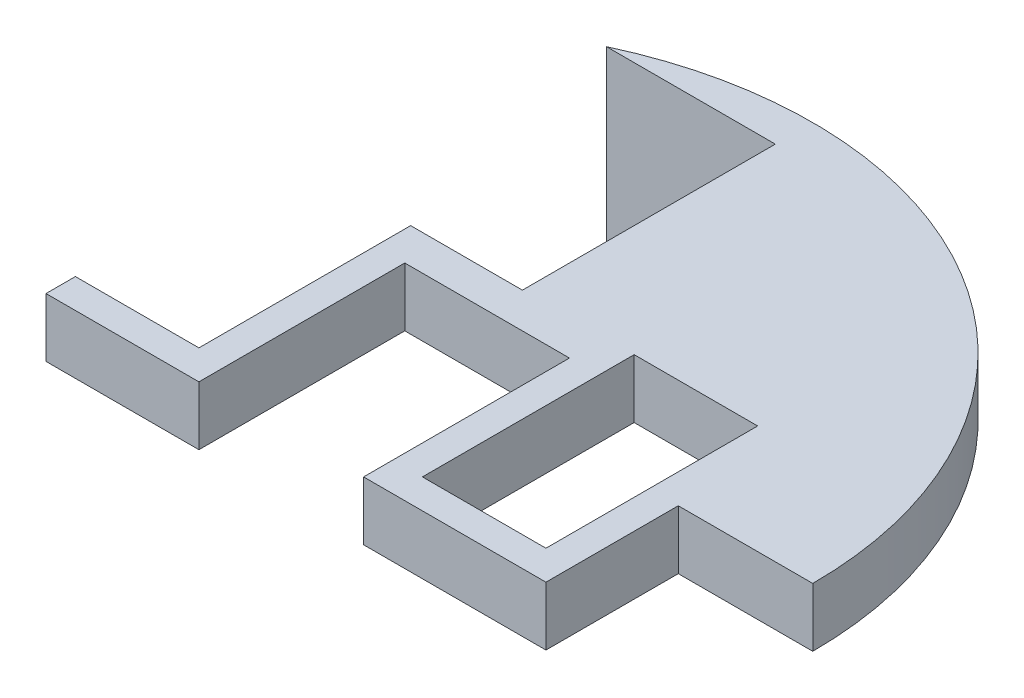
ISO-10303-21;
HEADER;
FILE_DESCRIPTION(('STEP AP214'),'2;1');
FILE_NAME('part.step','',(''),(''),'','','');
FILE_SCHEMA(('AUTOMOTIVE_DESIGN { 1 0 10303 214 1 1 1 1 }'));
ENDSEC;
DATA;
#1=APPLICATION_CONTEXT('core data for automotive mechanical design processes');
#2=APPLICATION_PROTOCOL_DEFINITION('international standard','automotive_design',2000,#1);
#3=PRODUCT_CONTEXT('',#1,'mechanical');
#4=PRODUCT('Part','Part','',(#3));
#5=PRODUCT_RELATED_PRODUCT_CATEGORY('part','',(#4));
#6=PRODUCT_DEFINITION_FORMATION('','',#4);
#7=PRODUCT_DEFINITION_CONTEXT('part definition',#1,'design');
#8=PRODUCT_DEFINITION('design','',#6,#7);
#9=PRODUCT_DEFINITION_SHAPE('','',#8);
#10=(LENGTH_UNIT() NAMED_UNIT(*) SI_UNIT(.MILLI.,.METRE.));
#11=(NAMED_UNIT(*) PLANE_ANGLE_UNIT() SI_UNIT($,.RADIAN.));
#12=(NAMED_UNIT(*) SI_UNIT($,.STERADIAN.) SOLID_ANGLE_UNIT());
#13=UNCERTAINTY_MEASURE_WITH_UNIT(LENGTH_MEASURE(1.E-05),#10,'distance_accuracy_value','');
#14=(GEOMETRIC_REPRESENTATION_CONTEXT(3) GLOBAL_UNCERTAINTY_ASSIGNED_CONTEXT((#13)) GLOBAL_UNIT_ASSIGNED_CONTEXT((#10,
#11,#12)) REPRESENTATION_CONTEXT('',''));
#15=CARTESIAN_POINT('',(0.,0.,0.));
#16=DIRECTION('',(0.,0.,1.));
#17=DIRECTION('',(1.,0.,0.));
#18=AXIS2_PLACEMENT_3D('',#15,#16,#17);
#19=CARTESIAN_POINT('',(0.,0.,0.));
#20=DIRECTION('',(0.,1.,0.));
#21=DIRECTION('',(0.,0.,1.));
#22=AXIS2_PLACEMENT_3D('',#19,#20,#21);
#23=PLANE('',#22);
#24=DIRECTION('',(0.,0.,1.));
#25=VECTOR('',#24,1.);
#26=CARTESIAN_POINT('',(19.,0.,-18.5));
#27=LINE('',#26,#25);
#28=CARTESIAN_POINT('',(19.,0.,-18.5));
#29=VERTEX_POINT('',#28);
#30=CARTESIAN_POINT('',(19.,0.,17.5));
#31=VERTEX_POINT('',#30);
#32=EDGE_CURVE('E253',#29,#31,#27,.T.);
#33=ORIENTED_EDGE('',*,*,#32,.T.);
#34=DIRECTION('',(1.,0.,0.));
#35=VECTOR('',#34,1.);
#36=CARTESIAN_POINT('',(40.,0.,17.5));
#37=LINE('',#36,#35);
#38=CARTESIAN_POINT('',(40.,0.,17.5));
#39=VERTEX_POINT('',#38);
#40=EDGE_CURVE('E259',#31,#39,#37,.T.);
#41=ORIENTED_EDGE('',*,*,#40,.T.);
#42=DIRECTION('',(0.,0.,-1.));
#43=VECTOR('',#42,1.);
#44=CARTESIAN_POINT('',(40.,0.,-18.5));
#45=LINE('',#44,#43);
#46=CARTESIAN_POINT('',(40.,0.,-18.5));
#47=VERTEX_POINT('',#46);
#48=EDGE_CURVE('E283',#39,#47,#45,.T.);
#49=ORIENTED_EDGE('',*,*,#48,.T.);
#50=DIRECTION('',(-1.,0.,0.));
#51=VECTOR('',#50,1.);
#52=CARTESIAN_POINT('',(40.,0.,-18.5));
#53=LINE('',#52,#51);
#54=EDGE_CURVE('E269',#47,#29,#53,.T.);
#55=ORIENTED_EDGE('',*,*,#54,.T.);
#56=EDGE_LOOP('',(#33,#41,#49,#55));
#57=FACE_BOUND('',#56,.T.);
#58=DIRECTION('',(-1.12508110670557E-13,0.,1.));
#59=VECTOR('',#58,1.);
#60=CARTESIAN_POINT('',(0.,0.,-61.5));
#61=LINE('',#60,#59);
#62=CARTESIAN_POINT('',(1.2793585635329E-12,0.,-67.865));
#63=VERTEX_POINT('',#62);
#64=CARTESIAN_POINT('',(0.,0.,-61.5));
#65=VERTEX_POINT('',#64);
#66=EDGE_CURVE('E65',#63,#65,#61,.T.);
#67=ORIENTED_EDGE('',*,*,#66,.F.);
#68=CARTESIAN_POINT('',(0.,0.,0.));
#69=DIRECTION('',(0.,1.,0.));
#70=DIRECTION('',(0.,0.,1.));
#71=AXIS2_PLACEMENT_3D('',#68,#69,#70);
#72=CIRCLE('',#71,67.865);
#73=CARTESIAN_POINT('',(67.865,0.,-2.6188257756783E-13));
#74=VERTEX_POINT('',#73);
#75=EDGE_CURVE('E347',#74,#63,#72,.T.);
#76=ORIENTED_EDGE('',*,*,#75,.F.);
#77=DIRECTION('',(1.,0.,0.));
#78=VECTOR('',#77,1.);
#79=CARTESIAN_POINT('',(67.865,0.,-2.6188257756783E-13));
#80=LINE('',#79,#78);
#81=CARTESIAN_POINT('',(45.,0.,-1.7364939203643E-13));
#82=VERTEX_POINT('',#81);
#83=EDGE_CURVE('E308',#82,#74,#80,.T.);
#84=ORIENTED_EDGE('',*,*,#83,.F.);
#85=DIRECTION('',(0.,0.,-1.));
#86=VECTOR('',#85,1.);
#87=CARTESIAN_POINT('',(45.,0.,-1.7364939203643E-13));
#88=LINE('',#87,#86);
#89=CARTESIAN_POINT('',(45.,0.,22.5));
#90=VERTEX_POINT('',#89);
#91=EDGE_CURVE('E382',#90,#82,#88,.T.);
#92=ORIENTED_EDGE('',*,*,#91,.F.);
#93=DIRECTION('',(1.,0.,0.));
#94=VECTOR('',#93,1.);
#95=CARTESIAN_POINT('',(45.,0.,22.5));
#96=LINE('',#95,#94);
#97=CARTESIAN_POINT('',(14.,0.,22.5));
#98=VERTEX_POINT('',#97);
#99=EDGE_CURVE('E379',#98,#90,#96,.T.);
#100=ORIENTED_EDGE('',*,*,#99,.F.);
#101=DIRECTION('',(0.,0.,1.));
#102=VECTOR('',#101,1.);
#103=CARTESIAN_POINT('',(14.,0.,22.5));
#104=LINE('',#103,#102);
#105=CARTESIAN_POINT('',(14.,0.,-12.4999999999999));
#106=VERTEX_POINT('',#105);
#107=EDGE_CURVE('E376',#106,#98,#104,.T.);
#108=ORIENTED_EDGE('',*,*,#107,.F.);
#109=DIRECTION('',(1.,0.,0.));
#110=VECTOR('',#109,1.);
#111=CARTESIAN_POINT('',(-14.,0.,-12.5));
#112=LINE('',#111,#110);
#113=CARTESIAN_POINT('',(-14.,0.,-12.5));
#114=VERTEX_POINT('',#113);
#115=EDGE_CURVE('E373',#114,#106,#112,.T.);
#116=ORIENTED_EDGE('',*,*,#115,.F.);
#117=DIRECTION('',(0.,0.,-1.));
#118=VECTOR('',#117,1.);
#119=CARTESIAN_POINT('',(-14.,0.,-12.5));
#120=LINE('',#119,#118);
#121=CARTESIAN_POINT('',(-14.,0.,22.5));
#122=VERTEX_POINT('',#121);
#123=EDGE_CURVE('E370',#122,#114,#120,.T.);
#124=ORIENTED_EDGE('',*,*,#123,.F.);
#125=DIRECTION('',(1.,0.,0.));
#126=VECTOR('',#125,1.);
#127=CARTESIAN_POINT('',(-14.,0.,22.5));
#128=LINE('',#127,#126);
#129=CARTESIAN_POINT('',(-40.,0.,22.5));
#130=VERTEX_POINT('',#129);
#131=EDGE_CURVE('E367',#130,#122,#128,.T.);
#132=ORIENTED_EDGE('',*,*,#131,.F.);
#133=DIRECTION('',(0.,0.,1.));
#134=VECTOR('',#133,1.);
#135=CARTESIAN_POINT('',(-40.,0.,22.5));
#136=LINE('',#135,#134);
#137=CARTESIAN_POINT('',(-40.,0.,17.5));
#138=VERTEX_POINT('',#137);
#139=EDGE_CURVE('E364',#138,#130,#136,.T.);
#140=ORIENTED_EDGE('',*,*,#139,.F.);
#141=DIRECTION('',(-1.,0.,0.));
#142=VECTOR('',#141,1.);
#143=CARTESIAN_POINT('',(-40.,0.,17.5));
#144=LINE('',#143,#142);
#145=CARTESIAN_POINT('',(-19.,0.,17.5));
#146=VERTEX_POINT('',#145);
#147=EDGE_CURVE('E361',#146,#138,#144,.T.);
#148=ORIENTED_EDGE('',*,*,#147,.F.);
#149=DIRECTION('',(0.,0.,1.));
#150=VECTOR('',#149,1.);
#151=CARTESIAN_POINT('',(-19.,0.,-18.5));
#152=LINE('',#151,#150);
#153=CARTESIAN_POINT('',(-19.,0.,-18.5));
#154=VERTEX_POINT('',#153);
#155=EDGE_CURVE('E358',#154,#146,#152,.T.);
#156=ORIENTED_EDGE('',*,*,#155,.F.);
#157=DIRECTION('',(-1.,0.,0.));
#158=VECTOR('',#157,1.);
#159=CARTESIAN_POINT('',(-19.,0.,-18.5));
#160=LINE('',#159,#158);
#161=CARTESIAN_POINT('',(0.,0.,-18.5));
#162=VERTEX_POINT('',#161);
#163=EDGE_CURVE('E355',#162,#154,#160,.T.);
#164=ORIENTED_EDGE('',*,*,#163,.F.);
#165=DIRECTION('',(0.,0.,1.));
#166=VECTOR('',#165,1.);
#167=CARTESIAN_POINT('',(0.,0.,-61.5));
#168=LINE('',#167,#166);
#169=EDGE_CURVE('E351',#65,#162,#168,.T.);
#170=ORIENTED_EDGE('',*,*,#169,.F.);
#171=EDGE_LOOP('',(#67,#76,#84,#92,#100,#108,#116,#124,#132,#140,#148,#156,#164,#170));
#172=FACE_BOUND('',#171,.T.);
#173=ADVANCED_FACE('F38',(#57,#172),#23,.F.);
#174=DIRECTION('',(0.999863281102752,0.,-0.0165353893948497));
#175=VECTOR('',#174,1.);
#176=CARTESIAN_POINT('',(-2.24404155772547,0.,-67.8278888252259));
#177=LINE('',#176,#175);
#178=CARTESIAN_POINT('',(-2.24404155772553,0.,-67.8278888252259));
#179=VERTEX_POINT('',#178);
#180=EDGE_CURVE('E56',#179,#63,#177,.T.);
#181=ORIENTED_EDGE('',*,*,#180,.F.);
#182=EDGE_CURVE('E352',#63,#179,#72,.T.);
#183=ORIENTED_EDGE('',*,*,#182,.F.);
#184=EDGE_LOOP('',(#181,#183));
#185=FACE_BOUND('',#184,.T.);
#186=ADVANCED_FACE('F486',(#185),#23,.F.);
#187=DIRECTION('',(0.989100340970342,0.,-0.147243049045966));
#188=VECTOR('',#187,1.);
#189=CARTESIAN_POINT('',(-17.6099188939027,0.,-65.5404377583043));
#190=LINE('',#189,#188);
#191=CARTESIAN_POINT('',(-17.6099188939027,0.,-65.5404377583043));
#192=VERTEX_POINT('',#191);
#193=EDGE_CURVE('E469',#192,#179,#190,.T.);
#194=ORIENTED_EDGE('',*,*,#193,.F.);
#195=EDGE_CURVE('E481',#179,#192,#72,.T.);
#196=ORIENTED_EDGE('',*,*,#195,.F.);
#197=EDGE_LOOP('',(#194,#196));
#198=FACE_BOUND('',#197,.T.);
#199=ADVANCED_FACE('F488',(#198),#23,.F.);
#200=DIRECTION('',(0.93953547691471,0.,-0.342451584342441));
#201=VECTOR('',#200,1.);
#202=CARTESIAN_POINT('',(-28.6950906079769,0.,-61.5));
#203=LINE('',#202,#201);
#204=CARTESIAN_POINT('',(-28.6950906079769,0.,-61.5));
#205=VERTEX_POINT('',#204);
#206=EDGE_CURVE('E471',#205,#192,#203,.T.);
#207=ORIENTED_EDGE('',*,*,#206,.F.);
#208=EDGE_CURVE('E302',#192,#205,#72,.T.);
#209=ORIENTED_EDGE('',*,*,#208,.F.);
#210=EDGE_LOOP('',(#207,#209));
#211=FACE_BOUND('',#210,.T.);
#212=ADVANCED_FACE('F494',(#211),#23,.F.);
#213=CARTESIAN_POINT('',(0.,10.,0.));
#214=DIRECTION('',(0.,1.,0.));
#215=DIRECTION('',(0.,0.,1.));
#216=AXIS2_PLACEMENT_3D('',#213,#214,#215);
#217=PLANE('',#216);
#218=CARTESIAN_POINT('',(0.,10.,0.));
#219=DIRECTION('',(0.,1.,0.));
#220=DIRECTION('',(0.,0.,1.));
#221=AXIS2_PLACEMENT_3D('',#218,#219,#220);
#222=CIRCLE('',#221,67.865);
#223=CARTESIAN_POINT('',(67.865,10.,-2.6188257756783E-13));
#224=VERTEX_POINT('',#223);
#225=CARTESIAN_POINT('',(-28.6950906079769,10.,-61.5));
#226=VERTEX_POINT('',#225);
#227=EDGE_CURVE('E303',#224,#226,#222,.T.);
#228=ORIENTED_EDGE('',*,*,#227,.T.);
#229=DIRECTION('',(1.,0.,0.));
#230=VECTOR('',#229,1.);
#231=CARTESIAN_POINT('',(-28.6950906079769,10.,-61.5));
#232=LINE('',#231,#230);
#233=CARTESIAN_POINT('',(0.,10.,-61.5));
#234=VERTEX_POINT('',#233);
#235=EDGE_CURVE('E307',#226,#234,#232,.T.);
#236=ORIENTED_EDGE('',*,*,#235,.T.);
#237=DIRECTION('',(0.,0.,1.));
#238=VECTOR('',#237,1.);
#239=CARTESIAN_POINT('',(0.,10.,-61.5));
#240=LINE('',#239,#238);
#241=CARTESIAN_POINT('',(0.,10.,-18.5));
#242=VERTEX_POINT('',#241);
#243=EDGE_CURVE('E311',#234,#242,#240,.T.);
#244=ORIENTED_EDGE('',*,*,#243,.T.);
#245=DIRECTION('',(-1.,0.,0.));
#246=VECTOR('',#245,1.);
#247=CARTESIAN_POINT('',(-19.,10.,-18.5));
#248=LINE('',#247,#246);
#249=CARTESIAN_POINT('',(-19.,10.,-18.5));
#250=VERTEX_POINT('',#249);
#251=EDGE_CURVE('E314',#242,#250,#248,.T.);
#252=ORIENTED_EDGE('',*,*,#251,.T.);
#253=DIRECTION('',(0.,0.,1.));
#254=VECTOR('',#253,1.);
#255=CARTESIAN_POINT('',(-19.,10.,-18.5));
#256=LINE('',#255,#254);
#257=CARTESIAN_POINT('',(-19.,10.,17.5));
#258=VERTEX_POINT('',#257);
#259=EDGE_CURVE('E317',#250,#258,#256,.T.);
#260=ORIENTED_EDGE('',*,*,#259,.T.);
#261=DIRECTION('',(-1.,0.,0.));
#262=VECTOR('',#261,1.);
#263=CARTESIAN_POINT('',(-40.,10.,17.5));
#264=LINE('',#263,#262);
#265=CARTESIAN_POINT('',(-40.,10.,17.5));
#266=VERTEX_POINT('',#265);
#267=EDGE_CURVE('E320',#258,#266,#264,.T.);
#268=ORIENTED_EDGE('',*,*,#267,.T.);
#269=DIRECTION('',(0.,0.,1.));
#270=VECTOR('',#269,1.);
#271=CARTESIAN_POINT('',(-40.,10.,22.5));
#272=LINE('',#271,#270);
#273=CARTESIAN_POINT('',(-40.,10.,22.5));
#274=VERTEX_POINT('',#273);
#275=EDGE_CURVE('E323',#266,#274,#272,.T.);
#276=ORIENTED_EDGE('',*,*,#275,.T.);
#277=DIRECTION('',(1.,0.,0.));
#278=VECTOR('',#277,1.);
#279=CARTESIAN_POINT('',(-14.,10.,22.5));
#280=LINE('',#279,#278);
#281=CARTESIAN_POINT('',(-14.,10.,22.5));
#282=VERTEX_POINT('',#281);
#283=EDGE_CURVE('E326',#274,#282,#280,.T.);
#284=ORIENTED_EDGE('',*,*,#283,.T.);
#285=DIRECTION('',(0.,0.,-1.));
#286=VECTOR('',#285,1.);
#287=CARTESIAN_POINT('',(-14.,10.,-12.5));
#288=LINE('',#287,#286);
#289=CARTESIAN_POINT('',(-14.,10.,-12.5));
#290=VERTEX_POINT('',#289);
#291=EDGE_CURVE('E329',#282,#290,#288,.T.);
#292=ORIENTED_EDGE('',*,*,#291,.T.);
#293=DIRECTION('',(1.,0.,0.));
#294=VECTOR('',#293,1.);
#295=CARTESIAN_POINT('',(-14.,10.,-12.5));
#296=LINE('',#295,#294);
#297=CARTESIAN_POINT('',(14.,10.,-12.4999999999999));
#298=VERTEX_POINT('',#297);
#299=EDGE_CURVE('E332',#290,#298,#296,.T.);
#300=ORIENTED_EDGE('',*,*,#299,.T.);
#301=DIRECTION('',(0.,0.,1.));
#302=VECTOR('',#301,1.);
#303=CARTESIAN_POINT('',(14.,10.,22.5));
#304=LINE('',#303,#302);
#305=CARTESIAN_POINT('',(14.,10.,22.5));
#306=VERTEX_POINT('',#305);
#307=EDGE_CURVE('E335',#298,#306,#304,.T.);
#308=ORIENTED_EDGE('',*,*,#307,.T.);
#309=DIRECTION('',(1.,0.,0.));
#310=VECTOR('',#309,1.);
#311=CARTESIAN_POINT('',(45.,10.,22.5));
#312=LINE('',#311,#310);
#313=CARTESIAN_POINT('',(45.,10.,22.5));
#314=VERTEX_POINT('',#313);
#315=EDGE_CURVE('E338',#306,#314,#312,.T.);
#316=ORIENTED_EDGE('',*,*,#315,.T.);
#317=DIRECTION('',(0.,0.,-1.));
#318=VECTOR('',#317,1.);
#319=CARTESIAN_POINT('',(45.,10.,-1.7364939203643E-13));
#320=LINE('',#319,#318);
#321=CARTESIAN_POINT('',(45.,10.,-1.7364939203643E-13));
#322=VERTEX_POINT('',#321);
#323=EDGE_CURVE('E341',#314,#322,#320,.T.);
#324=ORIENTED_EDGE('',*,*,#323,.T.);
#325=DIRECTION('',(1.,0.,0.));
#326=VECTOR('',#325,1.);
#327=CARTESIAN_POINT('',(67.865,10.,-2.6188257756783E-13));
#328=LINE('',#327,#326);
#329=EDGE_CURVE('E344',#322,#224,#328,.T.);
#330=ORIENTED_EDGE('',*,*,#329,.T.);
#331=EDGE_LOOP('',(#228,#236,#244,#252,#260,#268,#276,#284,#292,#300,#308,#316,#324,#330));
#332=FACE_BOUND('',#331,.T.);
#333=DIRECTION('',(1.,0.,0.));
#334=VECTOR('',#333,1.);
#335=CARTESIAN_POINT('',(40.,10.,17.5));
#336=LINE('',#335,#334);
#337=CARTESIAN_POINT('',(19.,10.,17.5));
#338=VERTEX_POINT('',#337);
#339=CARTESIAN_POINT('',(40.,10.,17.5));
#340=VERTEX_POINT('',#339);
#341=EDGE_CURVE('E268',#338,#340,#336,.T.);
#342=ORIENTED_EDGE('',*,*,#341,.F.);
#343=DIRECTION('',(0.,0.,1.));
#344=VECTOR('',#343,1.);
#345=CARTESIAN_POINT('',(19.,10.,-18.5));
#346=LINE('',#345,#344);
#347=CARTESIAN_POINT('',(19.,10.,-18.5));
#348=VERTEX_POINT('',#347);
#349=EDGE_CURVE('E265',#348,#338,#346,.T.);
#350=ORIENTED_EDGE('',*,*,#349,.F.);
#351=DIRECTION('',(-1.,0.,0.));
#352=VECTOR('',#351,1.);
#353=CARTESIAN_POINT('',(40.,10.,-18.5));
#354=LINE('',#353,#352);
#355=CARTESIAN_POINT('',(40.,10.,-18.5));
#356=VERTEX_POINT('',#355);
#357=EDGE_CURVE('E276',#356,#348,#354,.T.);
#358=ORIENTED_EDGE('',*,*,#357,.F.);
#359=DIRECTION('',(0.,0.,-1.));
#360=VECTOR('',#359,1.);
#361=CARTESIAN_POINT('',(40.,10.,-18.5));
#362=LINE('',#361,#360);
#363=EDGE_CURVE('E272',#340,#356,#362,.T.);
#364=ORIENTED_EDGE('',*,*,#363,.F.);
#365=EDGE_LOOP('',(#342,#350,#358,#364));
#366=FACE_BOUND('',#365,.T.);
#367=ADVANCED_FACE('F498',(#332,#366),#217,.T.);
#368=CARTESIAN_POINT('',(0.,10.,0.));
#369=DIRECTION('',(0.,-1.,0.));
#370=DIRECTION('',(0.,0.,-1.));
#371=AXIS2_PLACEMENT_3D('',#368,#369,#370);
#372=CYLINDRICAL_SURFACE('',#371,67.865);
#373=ORIENTED_EDGE('',*,*,#75,.T.);
#374=ORIENTED_EDGE('',*,*,#182,.T.);
#375=ORIENTED_EDGE('',*,*,#195,.T.);
#376=ORIENTED_EDGE('',*,*,#208,.T.);
#377=DIRECTION('',(0.,-1.,0.));
#378=VECTOR('',#377,1.);
#379=CARTESIAN_POINT('',(-28.6950906079769,10.,-61.5));
#380=LINE('',#379,#378);
#381=EDGE_CURVE('E11',#226,#205,#380,.T.);
#382=ORIENTED_EDGE('',*,*,#381,.F.);
#383=ORIENTED_EDGE('',*,*,#227,.F.);
#384=DIRECTION('',(0.,-1.,0.));
#385=VECTOR('',#384,1.);
#386=CARTESIAN_POINT('',(67.865,10.,-2.6188257756783E-13));
#387=LINE('',#386,#385);
#388=EDGE_CURVE('E346',#224,#74,#387,.T.);
#389=ORIENTED_EDGE('',*,*,#388,.T.);
#390=EDGE_LOOP('',(#373,#374,#375,#376,#382,#383,#389));
#391=FACE_BOUND('',#390,.T.);
#392=ADVANCED_FACE('F40',(#391),#372,.T.);
#393=CARTESIAN_POINT('',(-28.6950906079769,10.,-61.5));
#394=DIRECTION('',(0.,0.,-1.));
#395=DIRECTION('',(-1.,0.,0.));
#396=AXIS2_PLACEMENT_3D('',#393,#394,#395);
#397=PLANE('',#396);
#398=ORIENTED_EDGE('',*,*,#381,.T.);
#399=DIRECTION('',(0.,1.,0.));
#400=VECTOR('',#399,1.);
#401=CARTESIAN_POINT('',(-28.6950906079769,-30.,-61.5));
#402=LINE('',#401,#400);
#403=CARTESIAN_POINT('',(-28.6950906079769,-30.,-61.5));
#404=VERTEX_POINT('',#403);
#405=EDGE_CURVE('E232',#404,#205,#402,.T.);
#406=ORIENTED_EDGE('',*,*,#405,.F.);
#407=DIRECTION('',(-1.,0.,0.));
#408=VECTOR('',#407,1.);
#409=CARTESIAN_POINT('',(0.,-30.,-61.5));
#410=LINE('',#409,#408);
#411=CARTESIAN_POINT('',(0.,-30.,-61.5));
#412=VERTEX_POINT('',#411);
#413=EDGE_CURVE('E239',#412,#404,#410,.T.);
#414=ORIENTED_EDGE('',*,*,#413,.F.);
#415=DIRECTION('',(0.,1.,0.));
#416=VECTOR('',#415,1.);
#417=CARTESIAN_POINT('',(0.,-30.,-61.5));
#418=LINE('',#417,#416);
#419=EDGE_CURVE('E445',#412,#65,#418,.T.);
#420=ORIENTED_EDGE('',*,*,#419,.T.);
#421=DIRECTION('',(0.,-1.,0.));
#422=VECTOR('',#421,1.);
#423=CARTESIAN_POINT('',(0.,10.,-61.5));
#424=LINE('',#423,#422);
#425=EDGE_CURVE('E47',#234,#65,#424,.T.);
#426=ORIENTED_EDGE('',*,*,#425,.F.);
#427=ORIENTED_EDGE('',*,*,#235,.F.);
#428=EDGE_LOOP('',(#398,#406,#414,#420,#426,#427));
#429=FACE_BOUND('',#428,.T.);
#430=ADVANCED_FACE('F250',(#429),#397,.F.);
#431=CARTESIAN_POINT('',(0.,10.,-61.5));
#432=DIRECTION('',(1.,0.,0.));
#433=DIRECTION('',(0.,0.,-1.));
#434=AXIS2_PLACEMENT_3D('',#431,#432,#433);
#435=PLANE('',#434);
#436=ORIENTED_EDGE('',*,*,#169,.T.);
#437=DIRECTION('',(0.,-1.,0.));
#438=VECTOR('',#437,1.);
#439=CARTESIAN_POINT('',(0.,10.,-18.5));
#440=LINE('',#439,#438);
#441=EDGE_CURVE('E430',#242,#162,#440,.T.);
#442=ORIENTED_EDGE('',*,*,#441,.F.);
#443=ORIENTED_EDGE('',*,*,#243,.F.);
#444=ORIENTED_EDGE('',*,*,#425,.T.);
#445=EDGE_LOOP('',(#436,#442,#443,#444));
#446=FACE_BOUND('',#445,.T.);
#447=ADVANCED_FACE('F438',(#446),#435,.F.);
#448=CARTESIAN_POINT('',(-19.,10.,-18.5));
#449=DIRECTION('',(0.,0.,1.));
#450=DIRECTION('',(1.,0.,0.));
#451=AXIS2_PLACEMENT_3D('',#448,#449,#450);
#452=PLANE('',#451);
#453=ORIENTED_EDGE('',*,*,#163,.T.);
#454=DIRECTION('',(0.,-1.,0.));
#455=VECTOR('',#454,1.);
#456=CARTESIAN_POINT('',(-19.,10.,-18.5));
#457=LINE('',#456,#455);
#458=EDGE_CURVE('E426',#250,#154,#457,.T.);
#459=ORIENTED_EDGE('',*,*,#458,.F.);
#460=ORIENTED_EDGE('',*,*,#251,.F.);
#461=ORIENTED_EDGE('',*,*,#441,.T.);
#462=EDGE_LOOP('',(#453,#459,#460,#461));
#463=FACE_BOUND('',#462,.T.);
#464=ADVANCED_FACE('F540',(#463),#452,.F.);
#465=CARTESIAN_POINT('',(-19.,10.,-18.5));
#466=DIRECTION('',(1.,0.,0.));
#467=DIRECTION('',(0.,0.,-1.));
#468=AXIS2_PLACEMENT_3D('',#465,#466,#467);
#469=PLANE('',#468);
#470=ORIENTED_EDGE('',*,*,#155,.T.);
#471=DIRECTION('',(0.,-1.,0.));
#472=VECTOR('',#471,1.);
#473=CARTESIAN_POINT('',(-19.,10.,17.5));
#474=LINE('',#473,#472);
#475=EDGE_CURVE('E422',#258,#146,#474,.T.);
#476=ORIENTED_EDGE('',*,*,#475,.F.);
#477=ORIENTED_EDGE('',*,*,#259,.F.);
#478=ORIENTED_EDGE('',*,*,#458,.T.);
#479=EDGE_LOOP('',(#470,#476,#477,#478));
#480=FACE_BOUND('',#479,.T.);
#481=ADVANCED_FACE('F536',(#480),#469,.F.);
#482=CARTESIAN_POINT('',(-40.,10.,17.5));
#483=DIRECTION('',(0.,0.,1.));
#484=DIRECTION('',(1.,0.,0.));
#485=AXIS2_PLACEMENT_3D('',#482,#483,#484);
#486=PLANE('',#485);
#487=ORIENTED_EDGE('',*,*,#147,.T.);
#488=DIRECTION('',(0.,-1.,0.));
#489=VECTOR('',#488,1.);
#490=CARTESIAN_POINT('',(-40.,10.,17.5));
#491=LINE('',#490,#489);
#492=EDGE_CURVE('E418',#266,#138,#491,.T.);
#493=ORIENTED_EDGE('',*,*,#492,.F.);
#494=ORIENTED_EDGE('',*,*,#267,.F.);
#495=ORIENTED_EDGE('',*,*,#475,.T.);
#496=EDGE_LOOP('',(#487,#493,#494,#495));
#497=FACE_BOUND('',#496,.T.);
#498=ADVANCED_FACE('F532',(#497),#486,.F.);
#499=CARTESIAN_POINT('',(-40.,10.,22.5));
#500=DIRECTION('',(1.,0.,0.));
#501=DIRECTION('',(0.,0.,-1.));
#502=AXIS2_PLACEMENT_3D('',#499,#500,#501);
#503=PLANE('',#502);
#504=ORIENTED_EDGE('',*,*,#139,.T.);
#505=DIRECTION('',(0.,-1.,0.));
#506=VECTOR('',#505,1.);
#507=CARTESIAN_POINT('',(-40.,10.,22.5));
#508=LINE('',#507,#506);
#509=EDGE_CURVE('E414',#274,#130,#508,.T.);
#510=ORIENTED_EDGE('',*,*,#509,.F.);
#511=ORIENTED_EDGE('',*,*,#275,.F.);
#512=ORIENTED_EDGE('',*,*,#492,.T.);
#513=EDGE_LOOP('',(#504,#510,#511,#512));
#514=FACE_BOUND('',#513,.T.);
#515=ADVANCED_FACE('F528',(#514),#503,.F.);
#516=CARTESIAN_POINT('',(-14.,10.,22.5));
#517=DIRECTION('',(0.,0.,-1.));
#518=DIRECTION('',(-1.,0.,0.));
#519=AXIS2_PLACEMENT_3D('',#516,#517,#518);
#520=PLANE('',#519);
#521=ORIENTED_EDGE('',*,*,#131,.T.);
#522=DIRECTION('',(0.,-1.,0.));
#523=VECTOR('',#522,1.);
#524=CARTESIAN_POINT('',(-14.,10.,22.5));
#525=LINE('',#524,#523);
#526=EDGE_CURVE('E410',#282,#122,#525,.T.);
#527=ORIENTED_EDGE('',*,*,#526,.F.);
#528=ORIENTED_EDGE('',*,*,#283,.F.);
#529=ORIENTED_EDGE('',*,*,#509,.T.);
#530=EDGE_LOOP('',(#521,#527,#528,#529));
#531=FACE_BOUND('',#530,.T.);
#532=ADVANCED_FACE('F524',(#531),#520,.F.);
#533=CARTESIAN_POINT('',(-14.,10.,-12.5));
#534=DIRECTION('',(-1.,0.,0.));
#535=DIRECTION('',(0.,0.,1.));
#536=AXIS2_PLACEMENT_3D('',#533,#534,#535);
#537=PLANE('',#536);
#538=ORIENTED_EDGE('',*,*,#123,.T.);
#539=DIRECTION('',(0.,-1.,0.));
#540=VECTOR('',#539,1.);
#541=CARTESIAN_POINT('',(-14.,10.,-12.5));
#542=LINE('',#541,#540);
#543=EDGE_CURVE('E406',#290,#114,#542,.T.);
#544=ORIENTED_EDGE('',*,*,#543,.F.);
#545=ORIENTED_EDGE('',*,*,#291,.F.);
#546=ORIENTED_EDGE('',*,*,#526,.T.);
#547=EDGE_LOOP('',(#538,#544,#545,#546));
#548=FACE_BOUND('',#547,.T.);
#549=ADVANCED_FACE('F520',(#548),#537,.F.);
#550=CARTESIAN_POINT('',(-14.,10.,-12.5));
#551=DIRECTION('',(0.,0.,-1.));
#552=DIRECTION('',(-1.,0.,0.));
#553=AXIS2_PLACEMENT_3D('',#550,#551,#552);
#554=PLANE('',#553);
#555=ORIENTED_EDGE('',*,*,#115,.T.);
#556=DIRECTION('',(0.,-1.,0.));
#557=VECTOR('',#556,1.);
#558=CARTESIAN_POINT('',(14.,10.,-12.4999999999999));
#559=LINE('',#558,#557);
#560=EDGE_CURVE('E402',#298,#106,#559,.T.);
#561=ORIENTED_EDGE('',*,*,#560,.F.);
#562=ORIENTED_EDGE('',*,*,#299,.F.);
#563=ORIENTED_EDGE('',*,*,#543,.T.);
#564=EDGE_LOOP('',(#555,#561,#562,#563));
#565=FACE_BOUND('',#564,.T.);
#566=ADVANCED_FACE('F516',(#565),#554,.F.);
#567=CARTESIAN_POINT('',(14.,10.,22.5));
#568=DIRECTION('',(1.,0.,0.));
#569=DIRECTION('',(0.,0.,-1.));
#570=AXIS2_PLACEMENT_3D('',#567,#568,#569);
#571=PLANE('',#570);
#572=ORIENTED_EDGE('',*,*,#107,.T.);
#573=DIRECTION('',(0.,-1.,0.));
#574=VECTOR('',#573,1.);
#575=CARTESIAN_POINT('',(14.,10.,22.5));
#576=LINE('',#575,#574);
#577=EDGE_CURVE('E398',#306,#98,#576,.T.);
#578=ORIENTED_EDGE('',*,*,#577,.F.);
#579=ORIENTED_EDGE('',*,*,#307,.F.);
#580=ORIENTED_EDGE('',*,*,#560,.T.);
#581=EDGE_LOOP('',(#572,#578,#579,#580));
#582=FACE_BOUND('',#581,.T.);
#583=ADVANCED_FACE('F512',(#582),#571,.F.);
#584=CARTESIAN_POINT('',(45.,10.,22.5));
#585=DIRECTION('',(0.,0.,-1.));
#586=DIRECTION('',(-1.,0.,0.));
#587=AXIS2_PLACEMENT_3D('',#584,#585,#586);
#588=PLANE('',#587);
#589=ORIENTED_EDGE('',*,*,#99,.T.);
#590=DIRECTION('',(0.,-1.,0.));
#591=VECTOR('',#590,1.);
#592=CARTESIAN_POINT('',(45.,10.,22.5));
#593=LINE('',#592,#591);
#594=EDGE_CURVE('E394',#314,#90,#593,.T.);
#595=ORIENTED_EDGE('',*,*,#594,.F.);
#596=ORIENTED_EDGE('',*,*,#315,.F.);
#597=ORIENTED_EDGE('',*,*,#577,.T.);
#598=EDGE_LOOP('',(#589,#595,#596,#597));
#599=FACE_BOUND('',#598,.T.);
#600=ADVANCED_FACE('F508',(#599),#588,.F.);
#601=CARTESIAN_POINT('',(45.,10.,-1.7364939203643E-13));
#602=DIRECTION('',(-1.,0.,0.));
#603=DIRECTION('',(0.,0.,1.));
#604=AXIS2_PLACEMENT_3D('',#601,#602,#603);
#605=PLANE('',#604);
#606=ORIENTED_EDGE('',*,*,#91,.T.);
#607=DIRECTION('',(0.,-1.,0.));
#608=VECTOR('',#607,1.);
#609=CARTESIAN_POINT('',(45.,10.,-1.7364939203643E-13));
#610=LINE('',#609,#608);
#611=EDGE_CURVE('E390',#322,#82,#610,.T.);
#612=ORIENTED_EDGE('',*,*,#611,.F.);
#613=ORIENTED_EDGE('',*,*,#323,.F.);
#614=ORIENTED_EDGE('',*,*,#594,.T.);
#615=EDGE_LOOP('',(#606,#612,#613,#614));
#616=FACE_BOUND('',#615,.T.);
#617=ADVANCED_FACE('F504',(#616),#605,.F.);
#618=CARTESIAN_POINT('',(67.865,10.,-2.6188257756783E-13));
#619=DIRECTION('',(0.,0.,-1.));
#620=DIRECTION('',(-1.,0.,0.));
#621=AXIS2_PLACEMENT_3D('',#618,#619,#620);
#622=PLANE('',#621);
#623=ORIENTED_EDGE('',*,*,#83,.T.);
#624=ORIENTED_EDGE('',*,*,#388,.F.);
#625=ORIENTED_EDGE('',*,*,#329,.F.);
#626=ORIENTED_EDGE('',*,*,#611,.T.);
#627=EDGE_LOOP('',(#623,#624,#625,#626));
#628=FACE_BOUND('',#627,.T.);
#629=ADVANCED_FACE('F500',(#628),#622,.F.);
#630=CARTESIAN_POINT('',(19.,10.,-18.5));
#631=DIRECTION('',(1.,0.,0.));
#632=DIRECTION('',(0.,0.,-1.));
#633=AXIS2_PLACEMENT_3D('',#630,#631,#632);
#634=PLANE('',#633);
#635=ORIENTED_EDGE('',*,*,#32,.F.);
#636=DIRECTION('',(0.,-1.,0.));
#637=VECTOR('',#636,1.);
#638=CARTESIAN_POINT('',(19.,10.,-18.5));
#639=LINE('',#638,#637);
#640=EDGE_CURVE('E278',#348,#29,#639,.T.);
#641=ORIENTED_EDGE('',*,*,#640,.F.);
#642=ORIENTED_EDGE('',*,*,#349,.T.);
#643=DIRECTION('',(0.,-1.,0.));
#644=VECTOR('',#643,1.);
#645=CARTESIAN_POINT('',(19.,10.,17.5));
#646=LINE('',#645,#644);
#647=EDGE_CURVE('E298',#338,#31,#646,.T.);
#648=ORIENTED_EDGE('',*,*,#647,.T.);
#649=EDGE_LOOP('',(#635,#641,#642,#648));
#650=FACE_BOUND('',#649,.T.);
#651=ADVANCED_FACE('F503',(#650),#634,.T.);
#652=CARTESIAN_POINT('',(40.,10.,17.5));
#653=DIRECTION('',(0.,0.,-1.));
#654=DIRECTION('',(-1.,0.,0.));
#655=AXIS2_PLACEMENT_3D('',#652,#653,#654);
#656=PLANE('',#655);
#657=ORIENTED_EDGE('',*,*,#40,.F.);
#658=ORIENTED_EDGE('',*,*,#647,.F.);
#659=ORIENTED_EDGE('',*,*,#341,.T.);
#660=DIRECTION('',(0.,-1.,0.));
#661=VECTOR('',#660,1.);
#662=CARTESIAN_POINT('',(40.,10.,17.5));
#663=LINE('',#662,#661);
#664=EDGE_CURVE('E295',#340,#39,#663,.T.);
#665=ORIENTED_EDGE('',*,*,#664,.T.);
#666=EDGE_LOOP('',(#657,#658,#659,#665));
#667=FACE_BOUND('',#666,.T.);
#668=ADVANCED_FACE('F567',(#667),#656,.T.);
#669=CARTESIAN_POINT('',(40.,10.,-18.5));
#670=DIRECTION('',(-1.,0.,0.));
#671=DIRECTION('',(0.,0.,1.));
#672=AXIS2_PLACEMENT_3D('',#669,#670,#671);
#673=PLANE('',#672);
#674=ORIENTED_EDGE('',*,*,#48,.F.);
#675=ORIENTED_EDGE('',*,*,#664,.F.);
#676=ORIENTED_EDGE('',*,*,#363,.T.);
#677=DIRECTION('',(0.,-1.,0.));
#678=VECTOR('',#677,1.);
#679=CARTESIAN_POINT('',(40.,10.,-18.5));
#680=LINE('',#679,#678);
#681=EDGE_CURVE('E293',#356,#47,#680,.T.);
#682=ORIENTED_EDGE('',*,*,#681,.T.);
#683=EDGE_LOOP('',(#674,#675,#676,#682));
#684=FACE_BOUND('',#683,.T.);
#685=ADVANCED_FACE('F570',(#684),#673,.T.);
#686=CARTESIAN_POINT('',(40.,10.,-18.5));
#687=DIRECTION('',(0.,0.,1.));
#688=DIRECTION('',(1.,0.,0.));
#689=AXIS2_PLACEMENT_3D('',#686,#687,#688);
#690=PLANE('',#689);
#691=ORIENTED_EDGE('',*,*,#54,.F.);
#692=ORIENTED_EDGE('',*,*,#681,.F.);
#693=ORIENTED_EDGE('',*,*,#357,.T.);
#694=ORIENTED_EDGE('',*,*,#640,.T.);
#695=EDGE_LOOP('',(#691,#692,#693,#694));
#696=FACE_BOUND('',#695,.T.);
#697=ADVANCED_FACE('F575',(#696),#690,.T.);
#698=CARTESIAN_POINT('',(-28.6950906079769,-30.,-61.5));
#699=DIRECTION('',(0.342451584342441,0.,0.93953547691471));
#700=DIRECTION('',(0.93953547691471,0.,-0.342451584342441));
#701=AXIS2_PLACEMENT_3D('',#698,#699,#700);
#702=PLANE('',#701);
#703=ORIENTED_EDGE('',*,*,#206,.T.);
#704=DIRECTION('',(0.,1.,0.));
#705=VECTOR('',#704,1.);
#706=CARTESIAN_POINT('',(-17.6099188939027,-30.,-65.5404377583043));
#707=LINE('',#706,#705);
#708=CARTESIAN_POINT('',(-17.6099188939027,-30.,-65.5404377583043));
#709=VERTEX_POINT('',#708);
#710=EDGE_CURVE('E234',#709,#192,#707,.T.);
#711=ORIENTED_EDGE('',*,*,#710,.F.);
#712=DIRECTION('',(0.93953547691471,0.,-0.342451584342441));
#713=VECTOR('',#712,1.);
#714=CARTESIAN_POINT('',(-28.6950906079769,-30.,-61.5));
#715=LINE('',#714,#713);
#716=EDGE_CURVE('E227',#404,#709,#715,.T.);
#717=ORIENTED_EDGE('',*,*,#716,.F.);
#718=ORIENTED_EDGE('',*,*,#405,.T.);
#719=EDGE_LOOP('',(#703,#711,#717,#718));
#720=FACE_BOUND('',#719,.T.);
#721=ADVANCED_FACE('F230',(#720),#702,.F.);
#722=CARTESIAN_POINT('',(-17.6099188939027,-30.,-65.5404377583043));
#723=DIRECTION('',(0.147243049045966,0.,0.989100340970342));
#724=DIRECTION('',(0.989100340970342,0.,-0.147243049045966));
#725=AXIS2_PLACEMENT_3D('',#722,#723,#724);
#726=PLANE('',#725);
#727=ORIENTED_EDGE('',*,*,#193,.T.);
#728=DIRECTION('',(0.,1.,0.));
#729=VECTOR('',#728,1.);
#730=CARTESIAN_POINT('',(-2.24404155772547,-30.,-67.8278888252259));
#731=LINE('',#730,#729);
#732=CARTESIAN_POINT('',(-2.24404155772547,-30.,-67.8278888252259));
#733=VERTEX_POINT('',#732);
#734=EDGE_CURVE('E261',#733,#179,#731,.T.);
#735=ORIENTED_EDGE('',*,*,#734,.F.);
#736=DIRECTION('',(0.989100340970342,0.,-0.147243049045966));
#737=VECTOR('',#736,1.);
#738=CARTESIAN_POINT('',(-17.6099188939027,-30.,-65.5404377583043));
#739=LINE('',#738,#737);
#740=EDGE_CURVE('E238',#709,#733,#739,.T.);
#741=ORIENTED_EDGE('',*,*,#740,.F.);
#742=ORIENTED_EDGE('',*,*,#710,.T.);
#743=EDGE_LOOP('',(#727,#735,#741,#742));
#744=FACE_BOUND('',#743,.T.);
#745=ADVANCED_FACE('F467',(#744),#726,.F.);
#746=CARTESIAN_POINT('',(-2.24404155772547,-30.,-67.8278888252259));
#747=DIRECTION('',(0.0165353893948497,0.,0.999863281102752));
#748=DIRECTION('',(0.999863281102752,0.,-0.0165353893948497));
#749=AXIS2_PLACEMENT_3D('',#746,#747,#748);
#750=PLANE('',#749);
#751=ORIENTED_EDGE('',*,*,#180,.T.);
#752=DIRECTION('',(0.,1.,0.));
#753=VECTOR('',#752,1.);
#754=CARTESIAN_POINT('',(7.10848143181768E-13,-30.,-67.865));
#755=LINE('',#754,#753);
#756=CARTESIAN_POINT('',(7.10848143181768E-13,-30.,-67.865));
#757=VERTEX_POINT('',#756);
#758=EDGE_CURVE('E447',#757,#63,#755,.T.);
#759=ORIENTED_EDGE('',*,*,#758,.F.);
#760=DIRECTION('',(0.999863281102752,0.,-0.0165353893948497));
#761=VECTOR('',#760,1.);
#762=CARTESIAN_POINT('',(-2.24404155772547,-30.,-67.8278888252259));
#763=LINE('',#762,#761);
#764=EDGE_CURVE('E454',#733,#757,#763,.T.);
#765=ORIENTED_EDGE('',*,*,#764,.F.);
#766=ORIENTED_EDGE('',*,*,#734,.T.);
#767=EDGE_LOOP('',(#751,#759,#765,#766));
#768=FACE_BOUND('',#767,.T.);
#769=ADVANCED_FACE('F464',(#768),#750,.F.);
#770=CARTESIAN_POINT('',(0.,-30.,-61.5));
#771=DIRECTION('',(-1.,0.,-1.12508110670557E-13));
#772=DIRECTION('',(-1.12508110670557E-13,0.,1.));
#773=AXIS2_PLACEMENT_3D('',#770,#771,#772);
#774=PLANE('',#773);
#775=ORIENTED_EDGE('',*,*,#66,.T.);
#776=ORIENTED_EDGE('',*,*,#419,.F.);
#777=DIRECTION('',(-1.12508110670557E-13,0.,1.));
#778=VECTOR('',#777,1.);
#779=CARTESIAN_POINT('',(0.,-30.,-61.5));
#780=LINE('',#779,#778);
#781=EDGE_CURVE('E244',#757,#412,#780,.T.);
#782=ORIENTED_EDGE('',*,*,#781,.F.);
#783=ORIENTED_EDGE('',*,*,#758,.T.);
#784=EDGE_LOOP('',(#775,#776,#782,#783));
#785=FACE_BOUND('',#784,.T.);
#786=ADVANCED_FACE('F444',(#785),#774,.F.);
#787=CARTESIAN_POINT('',(0.,-30.,0.));
#788=DIRECTION('',(0.,-1.,0.));
#789=DIRECTION('',(0.,0.,-1.));
#790=AXIS2_PLACEMENT_3D('',#787,#788,#789);
#791=PLANE('',#790);
#792=ORIENTED_EDGE('',*,*,#413,.T.);
#793=ORIENTED_EDGE('',*,*,#716,.T.);
#794=ORIENTED_EDGE('',*,*,#740,.T.);
#795=ORIENTED_EDGE('',*,*,#764,.T.);
#796=ORIENTED_EDGE('',*,*,#781,.T.);
#797=EDGE_LOOP('',(#792,#793,#794,#795,#796));
#798=FACE_BOUND('',#797,.T.);
#799=ADVANCED_FACE('F242',(#798),#791,.T.);
#800=CLOSED_SHELL('',(#173,#186,#199,#212,#367,#392,#430,#447,#464,#481,#498,#515,#532,#549,
#566,#583,#600,#617,#629,#651,#668,#685,#697,#721,#745,#769,#786,#799));
#801=MANIFOLD_SOLID_BREP('B2',#800);
#802=ADVANCED_BREP_SHAPE_REPRESENTATION('',(#18,#801),#14);
#803=SHAPE_DEFINITION_REPRESENTATION(#9,#802);
ENDSEC;
END-ISO-10303-21;
